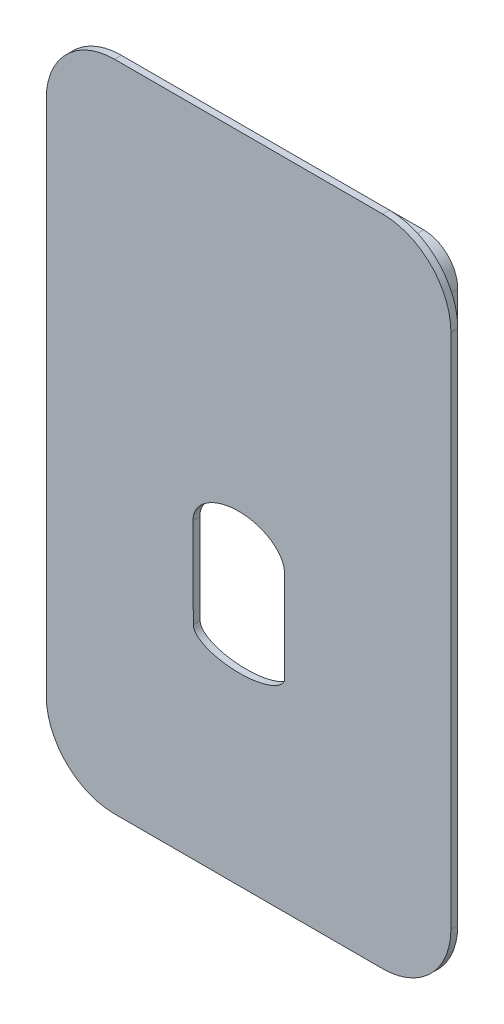
ISO-10303-21;
HEADER;
FILE_DESCRIPTION(('STEP AP214'),'2;1');
FILE_NAME('part.step','',(''),(''),'','','');
FILE_SCHEMA(('AUTOMOTIVE_DESIGN { 1 0 10303 214 1 1 1 1 }'));
ENDSEC;
DATA;
#1=APPLICATION_CONTEXT('core data for automotive mechanical design processes');
#2=APPLICATION_PROTOCOL_DEFINITION('international standard','automotive_design',2000,#1);
#3=PRODUCT_CONTEXT('',#1,'mechanical');
#4=PRODUCT('Part','Part','',(#3));
#5=PRODUCT_RELATED_PRODUCT_CATEGORY('part','',(#4));
#6=PRODUCT_DEFINITION_FORMATION('','',#4);
#7=PRODUCT_DEFINITION_CONTEXT('part definition',#1,'design');
#8=PRODUCT_DEFINITION('design','',#6,#7);
#9=PRODUCT_DEFINITION_SHAPE('','',#8);
#10=(LENGTH_UNIT() NAMED_UNIT(*) SI_UNIT(.MILLI.,.METRE.));
#11=(NAMED_UNIT(*) PLANE_ANGLE_UNIT() SI_UNIT($,.RADIAN.));
#12=(NAMED_UNIT(*) SI_UNIT($,.STERADIAN.) SOLID_ANGLE_UNIT());
#13=UNCERTAINTY_MEASURE_WITH_UNIT(LENGTH_MEASURE(1.E-05),#10,'distance_accuracy_value','');
#14=(GEOMETRIC_REPRESENTATION_CONTEXT(3) GLOBAL_UNCERTAINTY_ASSIGNED_CONTEXT((#13)) GLOBAL_UNIT_ASSIGNED_CONTEXT((#10,
#11,#12)) REPRESENTATION_CONTEXT('',''));
#15=CARTESIAN_POINT('',(0.,0.,0.));
#16=DIRECTION('',(0.,0.,1.));
#17=DIRECTION('',(1.,0.,0.));
#18=AXIS2_PLACEMENT_3D('',#15,#16,#17);
#19=CARTESIAN_POINT('',(-48.5561500397628,95.1688054108552,2.));
#20=DIRECTION('',(0.,1.,0.));
#21=DIRECTION('',(0.,0.,1.));
#22=AXIS2_PLACEMENT_3D('',#19,#20,#21);
#23=PLANE('',#22);
#24=DIRECTION('',(1.,0.,0.));
#25=VECTOR('',#24,1.);
#26=CARTESIAN_POINT('',(-48.5561500397628,95.1688054108552,0.));
#27=LINE('',#26,#25);
#28=CARTESIAN_POINT('',(-48.5561500397628,95.1688054108552,0.));
#29=VERTEX_POINT('',#28);
#30=CARTESIAN_POINT('',(29.9608617764506,95.1688054108552,0.));
#31=VERTEX_POINT('',#30);
#32=EDGE_CURVE('E358',#29,#31,#27,.T.);
#33=ORIENTED_EDGE('',*,*,#32,.F.);
#34=DIRECTION('',(0.,0.,-1.));
#35=VECTOR('',#34,1.);
#36=CARTESIAN_POINT('',(-48.5561500397628,95.1688054108552,2.));
#37=LINE('',#36,#35);
#38=CARTESIAN_POINT('',(-48.5561500397628,95.1688054108552,2.));
#39=VERTEX_POINT('',#38);
#40=EDGE_CURVE('E360',#39,#29,#37,.T.);
#41=ORIENTED_EDGE('',*,*,#40,.F.);
#42=DIRECTION('',(1.,0.,0.));
#43=VECTOR('',#42,1.);
#44=CARTESIAN_POINT('',(-48.5561500397628,95.1688054108552,2.));
#45=LINE('',#44,#43);
#46=CARTESIAN_POINT('',(29.9608617764506,95.1688054108552,2.));
#47=VERTEX_POINT('',#46);
#48=EDGE_CURVE('E392',#39,#47,#45,.T.);
#49=ORIENTED_EDGE('',*,*,#48,.T.);
#50=DIRECTION('',(0.,0.,-1.));
#51=VECTOR('',#50,1.);
#52=CARTESIAN_POINT('',(29.9608617764506,95.1688054108552,2.));
#53=LINE('',#52,#51);
#54=EDGE_CURVE('E362',#47,#31,#53,.T.);
#55=ORIENTED_EDGE('',*,*,#54,.T.);
#56=EDGE_LOOP('',(#33,#41,#49,#55));
#57=FACE_BOUND('',#56,.T.);
#58=ADVANCED_FACE('F37',(#57),#23,.T.);
#59=CARTESIAN_POINT('',(-48.5561500397628,75.1688054108552,2.));
#60=DIRECTION('',(0.,0.,-1.));
#61=DIRECTION('',(-1.,0.,0.));
#62=AXIS2_PLACEMENT_3D('',#59,#60,#61);
#63=CYLINDRICAL_SURFACE('',#62,20.);
#64=CARTESIAN_POINT('',(-48.5561500397628,75.1688054108552,0.));
#65=DIRECTION('',(0.,0.,1.));
#66=DIRECTION('',(1.,0.,0.));
#67=AXIS2_PLACEMENT_3D('',#64,#65,#66);
#68=CIRCLE('',#67,20.);
#69=CARTESIAN_POINT('',(-68.5561500397628,75.1688054011767,0.));
#70=VERTEX_POINT('',#69);
#71=EDGE_CURVE('E390',#29,#70,#68,.T.);
#72=ORIENTED_EDGE('',*,*,#71,.T.);
#73=DIRECTION('',(0.,0.,-1.));
#74=VECTOR('',#73,1.);
#75=CARTESIAN_POINT('',(-68.5561500397628,75.1688054011767,2.));
#76=LINE('',#75,#74);
#77=CARTESIAN_POINT('',(-68.5561500397628,75.1688054011767,2.));
#78=VERTEX_POINT('',#77);
#79=EDGE_CURVE('E395',#78,#70,#76,.T.);
#80=ORIENTED_EDGE('',*,*,#79,.F.);
#81=CARTESIAN_POINT('',(-48.5561500397628,75.1688054108552,2.));
#82=DIRECTION('',(0.,0.,1.));
#83=DIRECTION('',(1.,0.,0.));
#84=AXIS2_PLACEMENT_3D('',#81,#82,#83);
#85=CIRCLE('',#84,20.);
#86=EDGE_CURVE('E375',#39,#78,#85,.T.);
#87=ORIENTED_EDGE('',*,*,#86,.F.);
#88=ORIENTED_EDGE('',*,*,#40,.T.);
#89=EDGE_LOOP('',(#72,#80,#87,#88));
#90=FACE_BOUND('',#89,.T.);
#91=ADVANCED_FACE('F323',(#90),#63,.T.);
#92=CARTESIAN_POINT('',(-68.5561500397628,75.1688054011767,2.));
#93=DIRECTION('',(1.,4.83926662379521E-10,0.));
#94=DIRECTION('',(-4.83926662379521E-10,1.,0.));
#95=AXIS2_PLACEMENT_3D('',#92,#93,#94);
#96=PLANE('',#95);
#97=DIRECTION('',(4.8392666237952E-10,-1.,0.));
#98=VECTOR('',#97,1.);
#99=CARTESIAN_POINT('',(-68.5561500397628,75.1688054011767,0.));
#100=LINE('',#99,#98);
#101=CARTESIAN_POINT('',(-68.556149966485,-76.2544957623988,0.));
#102=VERTEX_POINT('',#101);
#103=EDGE_CURVE('E388',#70,#102,#100,.T.);
#104=ORIENTED_EDGE('',*,*,#103,.T.);
#105=DIRECTION('',(0.,0.,-1.));
#106=VECTOR('',#105,1.);
#107=CARTESIAN_POINT('',(-68.556149966485,-76.2544957623988,2.));
#108=LINE('',#107,#106);
#109=CARTESIAN_POINT('',(-68.556149966485,-76.2544957623988,2.));
#110=VERTEX_POINT('',#109);
#111=EDGE_CURVE('E398',#110,#102,#108,.T.);
#112=ORIENTED_EDGE('',*,*,#111,.F.);
#113=DIRECTION('',(4.8392666237952E-10,-1.,0.));
#114=VECTOR('',#113,1.);
#115=CARTESIAN_POINT('',(-68.5561500397628,75.1688054011767,2.));
#116=LINE('',#115,#114);
#117=EDGE_CURVE('E566',#78,#110,#116,.T.);
#118=ORIENTED_EDGE('',*,*,#117,.F.);
#119=ORIENTED_EDGE('',*,*,#79,.T.);
#120=EDGE_LOOP('',(#104,#112,#118,#119));
#121=FACE_BOUND('',#120,.T.);
#122=ADVANCED_FACE('F326',(#121),#96,.F.);
#123=CARTESIAN_POINT('',(-48.556149966485,-76.2544957527203,2.));
#124=DIRECTION('',(0.,0.,-1.));
#125=DIRECTION('',(-1.,0.,0.));
#126=AXIS2_PLACEMENT_3D('',#123,#124,#125);
#127=CYLINDRICAL_SURFACE('',#126,20.);
#128=CARTESIAN_POINT('',(-48.556149966485,-76.2544957527203,0.));
#129=DIRECTION('',(0.,0.,1.));
#130=DIRECTION('',(1.,0.,0.));
#131=AXIS2_PLACEMENT_3D('',#128,#129,#130);
#132=CIRCLE('',#131,20.);
#133=CARTESIAN_POINT('',(-48.556149966485,-96.2544957527203,0.));
#134=VERTEX_POINT('',#133);
#135=EDGE_CURVE('E386',#102,#134,#132,.T.);
#136=ORIENTED_EDGE('',*,*,#135,.T.);
#137=DIRECTION('',(0.,0.,-1.));
#138=VECTOR('',#137,1.);
#139=CARTESIAN_POINT('',(-48.556149966485,-96.2544957527203,2.));
#140=LINE('',#139,#138);
#141=CARTESIAN_POINT('',(-48.556149966485,-96.2544957527203,2.));
#142=VERTEX_POINT('',#141);
#143=EDGE_CURVE('E401',#142,#134,#140,.T.);
#144=ORIENTED_EDGE('',*,*,#143,.F.);
#145=CARTESIAN_POINT('',(-48.556149966485,-76.2544957527203,2.));
#146=DIRECTION('',(0.,0.,1.));
#147=DIRECTION('',(1.,0.,0.));
#148=AXIS2_PLACEMENT_3D('',#145,#146,#147);
#149=CIRCLE('',#148,20.);
#150=EDGE_CURVE('E565',#110,#142,#149,.T.);
#151=ORIENTED_EDGE('',*,*,#150,.F.);
#152=ORIENTED_EDGE('',*,*,#111,.T.);
#153=EDGE_LOOP('',(#136,#144,#151,#152));
#154=FACE_BOUND('',#153,.T.);
#155=ADVANCED_FACE('F330',(#154),#127,.T.);
#156=CARTESIAN_POINT('',(-48.556149966485,-96.2544957527203,2.));
#157=DIRECTION('',(0.,1.,0.));
#158=DIRECTION('',(-1.,0.,0.));
#159=AXIS2_PLACEMENT_3D('',#156,#157,#158);
#160=PLANE('',#159);
#161=DIRECTION('',(1.,0.,0.));
#162=VECTOR('',#161,1.);
#163=CARTESIAN_POINT('',(-48.556149966485,-96.2544957527203,0.));
#164=LINE('',#163,#162);
#165=CARTESIAN_POINT('',(29.9608617764506,-96.2544957527203,0.));
#166=VERTEX_POINT('',#165);
#167=EDGE_CURVE('E383',#134,#166,#164,.T.);
#168=ORIENTED_EDGE('',*,*,#167,.T.);
#169=DIRECTION('',(0.,0.,-1.));
#170=VECTOR('',#169,1.);
#171=CARTESIAN_POINT('',(29.9608617764506,-96.2544957527203,2.));
#172=LINE('',#171,#170);
#173=CARTESIAN_POINT('',(29.9608617764506,-96.2544957527203,2.));
#174=VERTEX_POINT('',#173);
#175=EDGE_CURVE('E404',#174,#166,#172,.T.);
#176=ORIENTED_EDGE('',*,*,#175,.F.);
#177=DIRECTION('',(1.,0.,0.));
#178=VECTOR('',#177,1.);
#179=CARTESIAN_POINT('',(-48.556149966485,-96.2544957527203,2.));
#180=LINE('',#179,#178);
#181=EDGE_CURVE('E563',#142,#174,#180,.T.);
#182=ORIENTED_EDGE('',*,*,#181,.F.);
#183=ORIENTED_EDGE('',*,*,#143,.T.);
#184=EDGE_LOOP('',(#168,#176,#182,#183));
#185=FACE_BOUND('',#184,.T.);
#186=ADVANCED_FACE('F334',(#185),#160,.F.);
#187=CARTESIAN_POINT('',(29.9608617764506,-76.2544957527203,2.));
#188=DIRECTION('',(0.,0.,-1.));
#189=DIRECTION('',(-1.,0.,0.));
#190=AXIS2_PLACEMENT_3D('',#187,#188,#189);
#191=CYLINDRICAL_SURFACE('',#190,20.);
#192=CARTESIAN_POINT('',(29.9608617764506,-76.2544957527203,0.));
#193=DIRECTION('',(0.,0.,-1.));
#194=DIRECTION('',(-1.,0.,0.));
#195=AXIS2_PLACEMENT_3D('',#192,#193,#194);
#196=CIRCLE('',#195,20.);
#197=CARTESIAN_POINT('',(49.9608617764506,-76.2544957527203,0.));
#198=VERTEX_POINT('',#197);
#199=EDGE_CURVE('E380',#198,#166,#196,.T.);
#200=ORIENTED_EDGE('',*,*,#199,.F.);
#201=DIRECTION('',(0.,0.,-1.));
#202=VECTOR('',#201,1.);
#203=CARTESIAN_POINT('',(49.9608617764506,-76.2544957527203,2.));
#204=LINE('',#203,#202);
#205=CARTESIAN_POINT('',(49.9608617764506,-76.2544957527203,2.));
#206=VERTEX_POINT('',#205);
#207=EDGE_CURVE('E406',#206,#198,#204,.T.);
#208=ORIENTED_EDGE('',*,*,#207,.F.);
#209=CARTESIAN_POINT('',(29.9608617764506,-76.2544957527203,2.));
#210=DIRECTION('',(0.,0.,-1.));
#211=DIRECTION('',(-1.,0.,0.));
#212=AXIS2_PLACEMENT_3D('',#209,#210,#211);
#213=CIRCLE('',#212,20.);
#214=EDGE_CURVE('E560',#206,#174,#213,.T.);
#215=ORIENTED_EDGE('',*,*,#214,.T.);
#216=ORIENTED_EDGE('',*,*,#175,.T.);
#217=EDGE_LOOP('',(#200,#208,#215,#216));
#218=FACE_BOUND('',#217,.T.);
#219=ADVANCED_FACE('F338',(#218),#191,.T.);
#220=CARTESIAN_POINT('',(49.9608617764506,75.1688054108552,2.));
#221=DIRECTION('',(1.,0.,0.));
#222=DIRECTION('',(0.,0.,-1.));
#223=AXIS2_PLACEMENT_3D('',#220,#221,#222);
#224=PLANE('',#223);
#225=DIRECTION('',(0.,-1.,0.));
#226=VECTOR('',#225,1.);
#227=CARTESIAN_POINT('',(49.9608617764506,75.1688054108552,0.));
#228=LINE('',#227,#226);
#229=CARTESIAN_POINT('',(49.9608617764506,75.1688054108552,0.));
#230=VERTEX_POINT('',#229);
#231=EDGE_CURVE('E369',#230,#198,#228,.T.);
#232=ORIENTED_EDGE('',*,*,#231,.F.);
#233=DIRECTION('',(0.,0.,-1.));
#234=VECTOR('',#233,1.);
#235=CARTESIAN_POINT('',(49.9608617764506,75.1688054108552,2.));
#236=LINE('',#235,#234);
#237=CARTESIAN_POINT('',(49.9608617764506,75.1688054108552,2.));
#238=VERTEX_POINT('',#237);
#239=EDGE_CURVE('E408',#238,#230,#236,.T.);
#240=ORIENTED_EDGE('',*,*,#239,.F.);
#241=DIRECTION('',(0.,-1.,0.));
#242=VECTOR('',#241,1.);
#243=CARTESIAN_POINT('',(49.9608617764506,75.1688054108552,2.));
#244=LINE('',#243,#242);
#245=EDGE_CURVE('E557',#238,#206,#244,.T.);
#246=ORIENTED_EDGE('',*,*,#245,.T.);
#247=ORIENTED_EDGE('',*,*,#207,.T.);
#248=EDGE_LOOP('',(#232,#240,#246,#247));
#249=FACE_BOUND('',#248,.T.);
#250=ADVANCED_FACE('F342',(#249),#224,.T.);
#251=CARTESIAN_POINT('',(29.9608617764506,75.1688054108552,2.));
#252=DIRECTION('',(0.,0.,-1.));
#253=DIRECTION('',(-1.,0.,0.));
#254=AXIS2_PLACEMENT_3D('',#251,#252,#253);
#255=CYLINDRICAL_SURFACE('',#254,20.);
#256=CARTESIAN_POINT('',(29.9608617764506,75.1688054108552,0.));
#257=DIRECTION('',(0.,0.,-1.));
#258=DIRECTION('',(-1.,0.,0.));
#259=AXIS2_PLACEMENT_3D('',#256,#257,#258);
#260=CIRCLE('',#259,20.);
#261=EDGE_CURVE('E366',#31,#230,#260,.T.);
#262=ORIENTED_EDGE('',*,*,#261,.F.);
#263=ORIENTED_EDGE('',*,*,#54,.F.);
#264=CARTESIAN_POINT('',(29.9608617764506,75.1688054108552,2.));
#265=DIRECTION('',(0.,0.,-1.));
#266=DIRECTION('',(-1.,0.,0.));
#267=AXIS2_PLACEMENT_3D('',#264,#265,#266);
#268=CIRCLE('',#267,20.);
#269=EDGE_CURVE('E554',#47,#238,#268,.T.);
#270=ORIENTED_EDGE('',*,*,#269,.T.);
#271=ORIENTED_EDGE('',*,*,#239,.T.);
#272=EDGE_LOOP('',(#262,#263,#270,#271));
#273=FACE_BOUND('',#272,.T.);
#274=ADVANCED_FACE('F319',(#273),#255,.T.);
#275=CARTESIAN_POINT('',(29.9608617764506,75.1688054108552,2.));
#276=DIRECTION('',(0.,0.,-1.));
#277=DIRECTION('',(-1.,0.,0.));
#278=AXIS2_PLACEMENT_3D('',#275,#276,#277);
#279=PLANE('',#278);
#280=DIRECTION('',(0.000137732706322048,-0.999999990514851,0.));
#281=VECTOR('',#280,1.);
#282=CARTESIAN_POINT('',(1.24931649522002,-10.4165911787865,2.));
#283=LINE('',#282,#281);
#284=CARTESIAN_POINT('',(1.24931649522002,-10.4165911787865,2.));
#285=VERTEX_POINT('',#284);
#286=CARTESIAN_POINT('',(1.25305055777223,-37.5275266748122,2.));
#287=VERTEX_POINT('',#286);
#288=EDGE_CURVE('E228',#285,#287,#283,.T.);
#289=ORIENTED_EDGE('',*,*,#288,.T.);
#290=CARTESIAN_POINT('',(-12.043749741007,-36.7007987978709,2.));
#291=DIRECTION('',(0.,0.,-1.));
#292=DIRECTION('',(1.,0.,0.));
#293=AXIS2_PLACEMENT_3D('',#290,#291,#292);
#294=ELLIPSE('',#293,13.4456532314958,5.57141059650843);
#295=CARTESIAN_POINT('',(-25.4894029725028,-36.7007987978713,2.));
#296=VERTEX_POINT('',#295);
#297=EDGE_CURVE('E223',#287,#296,#294,.T.);
#298=ORIENTED_EDGE('',*,*,#297,.T.);
#299=DIRECTION('',(-0.00404876312589482,0.999991803724986,0.));
#300=VECTOR('',#299,1.);
#301=CARTESIAN_POINT('',(-25.4894029725028,-36.7007987978713,2.));
#302=LINE('',#301,#300);
#303=CARTESIAN_POINT('',(-25.595818918365,-10.4174450083721,2.));
#304=VERTEX_POINT('',#303);
#305=EDGE_CURVE('E231',#296,#304,#302,.T.);
#306=ORIENTED_EDGE('',*,*,#305,.T.);
#307=CARTESIAN_POINT('',(-12.1732511821712,-10.4174450083722,2.));
#308=DIRECTION('',(0.,0.,-1.));
#309=DIRECTION('',(-1.,0.,0.));
#310=AXIS2_PLACEMENT_3D('',#307,#308,#309);
#311=ELLIPSE('',#310,13.4225677361938,9.12169870674967);
#312=EDGE_CURVE('E51',#304,#285,#311,.T.);
#313=ORIENTED_EDGE('',*,*,#312,.T.);
#314=EDGE_LOOP('',(#289,#298,#306,#313));
#315=FACE_BOUND('',#314,.T.);
#316=ORIENTED_EDGE('',*,*,#48,.F.);
#317=ORIENTED_EDGE('',*,*,#86,.T.);
#318=ORIENTED_EDGE('',*,*,#117,.T.);
#319=ORIENTED_EDGE('',*,*,#150,.T.);
#320=ORIENTED_EDGE('',*,*,#181,.T.);
#321=ORIENTED_EDGE('',*,*,#214,.F.);
#322=ORIENTED_EDGE('',*,*,#245,.F.);
#323=ORIENTED_EDGE('',*,*,#269,.F.);
#324=EDGE_LOOP('',(#316,#317,#318,#319,#320,#321,#322,#323));
#325=FACE_BOUND('',#324,.T.);
#326=ADVANCED_FACE('F235',(#315,#325),#279,.F.);
#327=CARTESIAN_POINT('',(29.9608617764506,75.1688054108552,0.));
#328=DIRECTION('',(0.,0.,-1.));
#329=DIRECTION('',(-1.,0.,0.));
#330=AXIS2_PLACEMENT_3D('',#327,#328,#329);
#331=PLANE('',#330);
#332=DIRECTION('',(4.83926683548097E-10,-1.,0.));
#333=VECTOR('',#332,1.);
#334=CARTESIAN_POINT('',(-58.5561500033866,-2.83368834724838E-08,0.));
#335=LINE('',#334,#333);
#336=CARTESIAN_POINT('',(-58.5561500397628,75.1688054108552,0.));
#337=VERTEX_POINT('',#336);
#338=CARTESIAN_POINT('',(-58.5561499816419,-44.9338570059206,0.));
#339=VERTEX_POINT('',#338);
#340=EDGE_CURVE('E489',#337,#339,#335,.T.);
#341=ORIENTED_EDGE('',*,*,#340,.T.);
#342=CARTESIAN_POINT('',(-48.5561499816419,-44.9338570010813,0.));
#343=DIRECTION('',(0.,0.,1.));
#344=DIRECTION('',(1.,0.,0.));
#345=AXIS2_PLACEMENT_3D('',#342,#343,#344);
#346=CIRCLE('',#345,10.);
#347=CARTESIAN_POINT('',(-48.5561499816419,-54.9338570010813,0.));
#348=VERTEX_POINT('',#347);
#349=EDGE_CURVE('E420',#348,#339,#346,.F.);
#350=ORIENTED_EDGE('',*,*,#349,.F.);
#351=DIRECTION('',(1.,0.,0.));
#352=VECTOR('',#351,1.);
#353=CARTESIAN_POINT('',(0.,-54.9338570010813,0.));
#354=LINE('',#353,#352);
#355=CARTESIAN_POINT('',(29.9608617764506,-54.9338570010813,0.));
#356=VERTEX_POINT('',#355);
#357=EDGE_CURVE('E474',#348,#356,#354,.T.);
#358=ORIENTED_EDGE('',*,*,#357,.T.);
#359=CARTESIAN_POINT('',(29.9608617764506,-44.9338570010813,0.));
#360=DIRECTION('',(0.,0.,1.));
#361=DIRECTION('',(1.,0.,0.));
#362=AXIS2_PLACEMENT_3D('',#359,#360,#361);
#363=CIRCLE('',#362,10.);
#364=CARTESIAN_POINT('',(39.9608617764506,-44.9338570010813,0.));
#365=VERTEX_POINT('',#364);
#366=EDGE_CURVE('E476',#356,#365,#363,.T.);
#367=ORIENTED_EDGE('',*,*,#366,.T.);
#368=DIRECTION('',(0.,-1.,0.));
#369=VECTOR('',#368,1.);
#370=CARTESIAN_POINT('',(39.9608617764506,0.,0.));
#371=LINE('',#370,#369);
#372=CARTESIAN_POINT('',(39.9608617764506,75.1688054108552,0.));
#373=VERTEX_POINT('',#372);
#374=EDGE_CURVE('E478',#373,#365,#371,.T.);
#375=ORIENTED_EDGE('',*,*,#374,.F.);
#376=CARTESIAN_POINT('',(29.9608617764506,75.1688054108552,0.));
#377=DIRECTION('',(0.,0.,1.));
#378=DIRECTION('',(1.,0.,0.));
#379=AXIS2_PLACEMENT_3D('',#376,#377,#378);
#380=CIRCLE('',#379,10.);
#381=CARTESIAN_POINT('',(29.9608617764506,85.1688054108552,0.));
#382=VERTEX_POINT('',#381);
#383=EDGE_CURVE('E481',#382,#373,#380,.F.);
#384=ORIENTED_EDGE('',*,*,#383,.F.);
#385=DIRECTION('',(1.,0.,0.));
#386=VECTOR('',#385,1.);
#387=CARTESIAN_POINT('',(0.,85.1688054108552,0.));
#388=LINE('',#387,#386);
#389=CARTESIAN_POINT('',(-48.5561500397628,85.1688054108552,0.));
#390=VERTEX_POINT('',#389);
#391=EDGE_CURVE('E484',#390,#382,#388,.T.);
#392=ORIENTED_EDGE('',*,*,#391,.F.);
#393=CARTESIAN_POINT('',(-48.5561500397628,75.1688054108552,0.));
#394=DIRECTION('',(0.,0.,1.));
#395=DIRECTION('',(1.,0.,0.));
#396=AXIS2_PLACEMENT_3D('',#393,#394,#395);
#397=CIRCLE('',#396,10.);
#398=EDGE_CURVE('E487',#390,#337,#397,.T.);
#399=ORIENTED_EDGE('',*,*,#398,.T.);
#400=EDGE_LOOP('',(#341,#350,#358,#367,#375,#384,#392,#399));
#401=FACE_BOUND('',#400,.T.);
#402=ORIENTED_EDGE('',*,*,#32,.T.);
#403=ORIENTED_EDGE('',*,*,#261,.T.);
#404=ORIENTED_EDGE('',*,*,#231,.T.);
#405=ORIENTED_EDGE('',*,*,#199,.T.);
#406=ORIENTED_EDGE('',*,*,#167,.F.);
#407=ORIENTED_EDGE('',*,*,#135,.F.);
#408=ORIENTED_EDGE('',*,*,#103,.F.);
#409=ORIENTED_EDGE('',*,*,#71,.F.);
#410=EDGE_LOOP('',(#402,#403,#404,#405,#406,#407,#408,#409));
#411=FACE_BOUND('',#410,.T.);
#412=ADVANCED_FACE('F285',(#401,#411),#331,.T.);
#413=CARTESIAN_POINT('',(37.9608617764506,0.,-10.));
#414=DIRECTION('',(-1.,0.,0.));
#415=DIRECTION('',(0.,0.,1.));
#416=AXIS2_PLACEMENT_3D('',#413,#414,#415);
#417=PLANE('',#416);
#418=DIRECTION('',(0.,-1.,0.));
#419=VECTOR('',#418,1.);
#420=CARTESIAN_POINT('',(37.9608617764506,0.,0.));
#421=LINE('',#420,#419);
#422=CARTESIAN_POINT('',(37.9608617764506,75.1688054108552,0.));
#423=VERTEX_POINT('',#422);
#424=CARTESIAN_POINT('',(37.9608617764506,-44.9338569865635,0.));
#425=VERTEX_POINT('',#424);
#426=EDGE_CURVE('E491',#423,#425,#421,.T.);
#427=ORIENTED_EDGE('',*,*,#426,.F.);
#428=DIRECTION('',(0.,0.,1.));
#429=VECTOR('',#428,1.);
#430=CARTESIAN_POINT('',(37.9608617764506,75.1688054108552,-10.));
#431=LINE('',#430,#429);
#432=CARTESIAN_POINT('',(37.9608617764506,75.1688054108552,-10.));
#433=VERTEX_POINT('',#432);
#434=EDGE_CURVE('E367',#433,#423,#431,.T.);
#435=ORIENTED_EDGE('',*,*,#434,.F.);
#436=DIRECTION('',(0.,-1.,0.));
#437=VECTOR('',#436,1.);
#438=CARTESIAN_POINT('',(37.9608617764506,0.,-10.));
#439=LINE('',#438,#437);
#440=CARTESIAN_POINT('',(37.9608617764506,-44.9338569865635,-10.));
#441=VERTEX_POINT('',#440);
#442=EDGE_CURVE('E448',#433,#441,#439,.T.);
#443=ORIENTED_EDGE('',*,*,#442,.T.);
#444=DIRECTION('',(0.,0.,1.));
#445=VECTOR('',#444,1.);
#446=CARTESIAN_POINT('',(37.9608617764506,-44.9338569865635,-10.));
#447=LINE('',#446,#445);
#448=EDGE_CURVE('E527',#441,#425,#447,.T.);
#449=ORIENTED_EDGE('',*,*,#448,.T.);
#450=EDGE_LOOP('',(#427,#435,#443,#449));
#451=FACE_BOUND('',#450,.T.);
#452=ADVANCED_FACE('F257',(#451),#417,.T.);
#453=CARTESIAN_POINT('',(29.9608617764506,75.1688054108552,-10.));
#454=DIRECTION('',(0.,0.,1.));
#455=DIRECTION('',(1.,0.,0.));
#456=AXIS2_PLACEMENT_3D('',#453,#454,#455);
#457=CYLINDRICAL_SURFACE('',#456,8.);
#458=CARTESIAN_POINT('',(29.9608617764506,75.1688054108552,0.));
#459=DIRECTION('',(0.,0.,1.));
#460=DIRECTION('',(1.,0.,0.));
#461=AXIS2_PLACEMENT_3D('',#458,#459,#460);
#462=CIRCLE('',#461,8.);
#463=CARTESIAN_POINT('',(29.9608617764506,83.1688054108552,0.));
#464=VERTEX_POINT('',#463);
#465=EDGE_CURVE('E430',#464,#423,#462,.F.);
#466=ORIENTED_EDGE('',*,*,#465,.F.);
#467=DIRECTION('',(0.,0.,1.));
#468=VECTOR('',#467,1.);
#469=CARTESIAN_POINT('',(29.9608617764506,83.1688054108552,-10.));
#470=LINE('',#469,#468);
#471=CARTESIAN_POINT('',(29.9608617764506,83.1688054108552,-10.));
#472=VERTEX_POINT('',#471);
#473=EDGE_CURVE('E372',#472,#464,#470,.T.);
#474=ORIENTED_EDGE('',*,*,#473,.F.);
#475=CARTESIAN_POINT('',(29.9608617764506,75.1688054108552,-10.));
#476=DIRECTION('',(0.,0.,1.));
#477=DIRECTION('',(1.,0.,0.));
#478=AXIS2_PLACEMENT_3D('',#475,#476,#477);
#479=CIRCLE('',#478,8.);
#480=EDGE_CURVE('E468',#472,#433,#479,.F.);
#481=ORIENTED_EDGE('',*,*,#480,.T.);
#482=ORIENTED_EDGE('',*,*,#434,.T.);
#483=EDGE_LOOP('',(#466,#474,#481,#482));
#484=FACE_BOUND('',#483,.T.);
#485=ADVANCED_FACE('F253',(#484),#457,.F.);
#486=CARTESIAN_POINT('',(0.,83.1688054108552,-10.));
#487=DIRECTION('',(0.,-1.,0.));
#488=DIRECTION('',(1.,0.,0.));
#489=AXIS2_PLACEMENT_3D('',#486,#487,#488);
#490=PLANE('',#489);
#491=DIRECTION('',(1.,0.,0.));
#492=VECTOR('',#491,1.);
#493=CARTESIAN_POINT('',(0.,83.1688054108552,0.));
#494=LINE('',#493,#492);
#495=CARTESIAN_POINT('',(-48.5561500397628,83.1688054108552,0.));
#496=VERTEX_POINT('',#495);
#497=EDGE_CURVE('E507',#496,#464,#494,.T.);
#498=ORIENTED_EDGE('',*,*,#497,.F.);
#499=DIRECTION('',(0.,0.,1.));
#500=VECTOR('',#499,1.);
#501=CARTESIAN_POINT('',(-48.5561500397628,83.1688054108552,-10.));
#502=LINE('',#501,#500);
#503=CARTESIAN_POINT('',(-48.5561500397628,83.1688054108552,-10.));
#504=VERTEX_POINT('',#503);
#505=EDGE_CURVE('E512',#504,#496,#502,.T.);
#506=ORIENTED_EDGE('',*,*,#505,.F.);
#507=DIRECTION('',(1.,0.,0.));
#508=VECTOR('',#507,1.);
#509=CARTESIAN_POINT('',(0.,83.1688054108552,-10.));
#510=LINE('',#509,#508);
#511=EDGE_CURVE('E465',#504,#472,#510,.T.);
#512=ORIENTED_EDGE('',*,*,#511,.T.);
#513=ORIENTED_EDGE('',*,*,#473,.T.);
#514=EDGE_LOOP('',(#498,#506,#512,#513));
#515=FACE_BOUND('',#514,.T.);
#516=ADVANCED_FACE('F256',(#515),#490,.T.);
#517=CARTESIAN_POINT('',(-48.5561500397628,75.1688054108552,-10.));
#518=DIRECTION('',(0.,0.,1.));
#519=DIRECTION('',(1.,0.,0.));
#520=AXIS2_PLACEMENT_3D('',#517,#518,#519);
#521=CYLINDRICAL_SURFACE('',#520,8.00000000000001);
#522=CARTESIAN_POINT('',(-48.5561500397628,75.1688054108552,0.));
#523=DIRECTION('',(0.,0.,1.));
#524=DIRECTION('',(1.,0.,0.));
#525=AXIS2_PLACEMENT_3D('',#522,#523,#524);
#526=CIRCLE('',#525,8.00000000000001);
#527=CARTESIAN_POINT('',(-56.5561500397628,75.1688054069838,0.));
#528=VERTEX_POINT('',#527);
#529=EDGE_CURVE('E504',#496,#528,#526,.T.);
#530=ORIENTED_EDGE('',*,*,#529,.T.);
#531=DIRECTION('',(0.,0.,1.));
#532=VECTOR('',#531,1.);
#533=CARTESIAN_POINT('',(-56.5561500397628,75.1688054069838,-10.));
#534=LINE('',#533,#532);
#535=CARTESIAN_POINT('',(-56.5561500397628,75.1688054069838,-10.));
#536=VERTEX_POINT('',#535);
#537=EDGE_CURVE('E515',#536,#528,#534,.T.);
#538=ORIENTED_EDGE('',*,*,#537,.F.);
#539=CARTESIAN_POINT('',(-48.5561500397628,75.1688054108552,-10.));
#540=DIRECTION('',(0.,0.,1.));
#541=DIRECTION('',(1.,0.,0.));
#542=AXIS2_PLACEMENT_3D('',#539,#540,#541);
#543=CIRCLE('',#542,8.00000000000001);
#544=EDGE_CURVE('E462',#504,#536,#543,.T.);
#545=ORIENTED_EDGE('',*,*,#544,.F.);
#546=ORIENTED_EDGE('',*,*,#505,.T.);
#547=EDGE_LOOP('',(#530,#538,#545,#546));
#548=FACE_BOUND('',#547,.T.);
#549=ADVANCED_FACE('F261',(#548),#521,.F.);
#550=CARTESIAN_POINT('',(-56.5561500033866,-2.73690301086959E-08,-10.));
#551=DIRECTION('',(-1.,-4.83926683606593E-10,0.));
#552=DIRECTION('',(4.83926683606593E-10,-1.,0.));
#553=AXIS2_PLACEMENT_3D('',#550,#551,#552);
#554=PLANE('',#553);
#555=DIRECTION('',(4.83926683606593E-10,-1.,0.));
#556=VECTOR('',#555,1.);
#557=CARTESIAN_POINT('',(-56.5561500033866,-2.73690301086959E-08,0.));
#558=LINE('',#557,#556);
#559=CARTESIAN_POINT('',(-56.5561499816419,-44.9338569865635,0.));
#560=VERTEX_POINT('',#559);
#561=EDGE_CURVE('E501',#528,#560,#558,.T.);
#562=ORIENTED_EDGE('',*,*,#561,.T.);
#563=DIRECTION('',(0.,0.,1.));
#564=VECTOR('',#563,1.);
#565=CARTESIAN_POINT('',(-56.5561499816419,-44.9338569904349,-10.));
#566=LINE('',#565,#564);
#567=CARTESIAN_POINT('',(-56.5561499816419,-44.9338569904349,-10.));
#568=VERTEX_POINT('',#567);
#569=EDGE_CURVE('E518',#568,#560,#566,.T.);
#570=ORIENTED_EDGE('',*,*,#569,.F.);
#571=DIRECTION('',(4.83926683606593E-10,-1.,0.));
#572=VECTOR('',#571,1.);
#573=CARTESIAN_POINT('',(-56.5561500033866,-2.73690301086959E-08,-10.));
#574=LINE('',#573,#572);
#575=EDGE_CURVE('E459',#536,#568,#574,.T.);
#576=ORIENTED_EDGE('',*,*,#575,.F.);
#577=ORIENTED_EDGE('',*,*,#537,.T.);
#578=EDGE_LOOP('',(#562,#570,#576,#577));
#579=FACE_BOUND('',#578,.T.);
#580=ADVANCED_FACE('F265',(#579),#554,.F.);
#581=CARTESIAN_POINT('',(-48.5561499816419,-44.9338569865635,-10.));
#582=DIRECTION('',(0.,0.,1.));
#583=DIRECTION('',(1.,0.,0.));
#584=AXIS2_PLACEMENT_3D('',#581,#582,#583);
#585=CYLINDRICAL_SURFACE('',#584,8.);
#586=CARTESIAN_POINT('',(-48.5561499816419,-44.9338569865635,0.));
#587=DIRECTION('',(0.,0.,1.));
#588=DIRECTION('',(1.,0.,0.));
#589=AXIS2_PLACEMENT_3D('',#586,#587,#588);
#590=CIRCLE('',#589,8.);
#591=CARTESIAN_POINT('',(-48.5561499816419,-52.9338569865635,0.));
#592=VERTEX_POINT('',#591);
#593=EDGE_CURVE('E498',#560,#592,#590,.T.);
#594=ORIENTED_EDGE('',*,*,#593,.T.);
#595=DIRECTION('',(0.,0.,1.));
#596=VECTOR('',#595,1.);
#597=CARTESIAN_POINT('',(-48.5561499816419,-52.9338569865635,-10.));
#598=LINE('',#597,#596);
#599=CARTESIAN_POINT('',(-48.5561499816419,-52.9338569865635,-10.));
#600=VERTEX_POINT('',#599);
#601=EDGE_CURVE('E521',#600,#592,#598,.T.);
#602=ORIENTED_EDGE('',*,*,#601,.F.);
#603=CARTESIAN_POINT('',(-48.5561499816419,-44.9338569865635,-10.));
#604=DIRECTION('',(0.,0.,1.));
#605=DIRECTION('',(1.,0.,0.));
#606=AXIS2_PLACEMENT_3D('',#603,#604,#605);
#607=CIRCLE('',#606,8.);
#608=EDGE_CURVE('E456',#568,#600,#607,.T.);
#609=ORIENTED_EDGE('',*,*,#608,.F.);
#610=ORIENTED_EDGE('',*,*,#569,.T.);
#611=EDGE_LOOP('',(#594,#602,#609,#610));
#612=FACE_BOUND('',#611,.T.);
#613=ADVANCED_FACE('F269',(#612),#585,.F.);
#614=CARTESIAN_POINT('',(0.,-52.9338569865635,-10.));
#615=DIRECTION('',(0.,-1.,0.));
#616=DIRECTION('',(1.,0.,0.));
#617=AXIS2_PLACEMENT_3D('',#614,#615,#616);
#618=PLANE('',#617);
#619=DIRECTION('',(1.,0.,0.));
#620=VECTOR('',#619,1.);
#621=CARTESIAN_POINT('',(0.,-52.9338569865635,0.));
#622=LINE('',#621,#620);
#623=CARTESIAN_POINT('',(29.9608617764506,-52.9338569865635,0.));
#624=VERTEX_POINT('',#623);
#625=EDGE_CURVE('E495',#592,#624,#622,.T.);
#626=ORIENTED_EDGE('',*,*,#625,.T.);
#627=DIRECTION('',(0.,0.,1.));
#628=VECTOR('',#627,1.);
#629=CARTESIAN_POINT('',(29.9608617764506,-52.9338569865635,-10.));
#630=LINE('',#629,#628);
#631=CARTESIAN_POINT('',(29.9608617764506,-52.9338569865635,-10.));
#632=VERTEX_POINT('',#631);
#633=EDGE_CURVE('E524',#632,#624,#630,.T.);
#634=ORIENTED_EDGE('',*,*,#633,.F.);
#635=DIRECTION('',(1.,0.,0.));
#636=VECTOR('',#635,1.);
#637=CARTESIAN_POINT('',(0.,-52.9338569865635,-10.));
#638=LINE('',#637,#636);
#639=EDGE_CURVE('E454',#600,#632,#638,.T.);
#640=ORIENTED_EDGE('',*,*,#639,.F.);
#641=ORIENTED_EDGE('',*,*,#601,.T.);
#642=EDGE_LOOP('',(#626,#634,#640,#641));
#643=FACE_BOUND('',#642,.T.);
#644=ADVANCED_FACE('F273',(#643),#618,.F.);
#645=CARTESIAN_POINT('',(-48.5561499816419,-44.9338570010813,-10.));
#646=DIRECTION('',(0.,0.,1.));
#647=DIRECTION('',(1.,0.,0.));
#648=AXIS2_PLACEMENT_3D('',#645,#646,#647);
#649=CYLINDRICAL_SURFACE('',#648,10.);
#650=ORIENTED_EDGE('',*,*,#349,.T.);
#651=DIRECTION('',(0.,0.,1.));
#652=VECTOR('',#651,1.);
#653=CARTESIAN_POINT('',(-58.5561499816419,-44.9338570059205,-10.));
#654=LINE('',#653,#652);
#655=CARTESIAN_POINT('',(-58.5561499816419,-44.9338570059205,-10.));
#656=VERTEX_POINT('',#655);
#657=EDGE_CURVE('E530',#656,#339,#654,.T.);
#658=ORIENTED_EDGE('',*,*,#657,.F.);
#659=CARTESIAN_POINT('',(-48.5561499816419,-44.9338570010813,-10.));
#660=DIRECTION('',(0.,0.,1.));
#661=DIRECTION('',(1.,0.,0.));
#662=AXIS2_PLACEMENT_3D('',#659,#660,#661);
#663=CIRCLE('',#662,10.);
#664=CARTESIAN_POINT('',(-48.5561499816419,-54.9338570010813,-10.));
#665=VERTEX_POINT('',#664);
#666=EDGE_CURVE('E427',#665,#656,#663,.F.);
#667=ORIENTED_EDGE('',*,*,#666,.F.);
#668=DIRECTION('',(0.,0.,1.));
#669=VECTOR('',#668,1.);
#670=CARTESIAN_POINT('',(-48.5561499816419,-54.9338570010813,-10.));
#671=LINE('',#670,#669);
#672=EDGE_CURVE('E471',#665,#348,#671,.T.);
#673=ORIENTED_EDGE('',*,*,#672,.T.);
#674=EDGE_LOOP('',(#650,#658,#667,#673));
#675=FACE_BOUND('',#674,.T.);
#676=ADVANCED_FACE('F277',(#675),#649,.T.);
#677=CARTESIAN_POINT('',(-58.5561500033866,-2.83368834724838E-08,-10.));
#678=DIRECTION('',(-1.,-4.83926683548097E-10,0.));
#679=DIRECTION('',(4.83926683548097E-10,-1.,0.));
#680=AXIS2_PLACEMENT_3D('',#677,#678,#679);
#681=PLANE('',#680);
#682=ORIENTED_EDGE('',*,*,#340,.F.);
#683=DIRECTION('',(0.,0.,1.));
#684=VECTOR('',#683,1.);
#685=CARTESIAN_POINT('',(-58.5561500397628,75.1688054060159,-10.));
#686=LINE('',#685,#684);
#687=CARTESIAN_POINT('',(-58.5561500397628,75.1688054060159,-10.));
#688=VERTEX_POINT('',#687);
#689=EDGE_CURVE('E533',#688,#337,#686,.T.);
#690=ORIENTED_EDGE('',*,*,#689,.F.);
#691=DIRECTION('',(4.83926683548097E-10,-1.,0.));
#692=VECTOR('',#691,1.);
#693=CARTESIAN_POINT('',(-58.5561500033866,-2.83368834724838E-08,-10.));
#694=LINE('',#693,#692);
#695=EDGE_CURVE('E445',#688,#656,#694,.T.);
#696=ORIENTED_EDGE('',*,*,#695,.T.);
#697=ORIENTED_EDGE('',*,*,#657,.T.);
#698=EDGE_LOOP('',(#682,#690,#696,#697));
#699=FACE_BOUND('',#698,.T.);
#700=ADVANCED_FACE('F287',(#699),#681,.T.);
#701=CARTESIAN_POINT('',(-48.5561500397628,75.1688054108552,-10.));
#702=DIRECTION('',(0.,0.,1.));
#703=DIRECTION('',(1.,0.,0.));
#704=AXIS2_PLACEMENT_3D('',#701,#702,#703);
#705=CYLINDRICAL_SURFACE('',#704,10.);
#706=ORIENTED_EDGE('',*,*,#398,.F.);
#707=DIRECTION('',(0.,0.,1.));
#708=VECTOR('',#707,1.);
#709=CARTESIAN_POINT('',(-48.5561500397628,85.1688054108552,-10.));
#710=LINE('',#709,#708);
#711=CARTESIAN_POINT('',(-48.5561500397628,85.1688054108552,-10.));
#712=VERTEX_POINT('',#711);
#713=EDGE_CURVE('E536',#712,#390,#710,.T.);
#714=ORIENTED_EDGE('',*,*,#713,.F.);
#715=CARTESIAN_POINT('',(-48.5561500397628,75.1688054108552,-10.));
#716=DIRECTION('',(0.,0.,1.));
#717=DIRECTION('',(1.,0.,0.));
#718=AXIS2_PLACEMENT_3D('',#715,#716,#717);
#719=CIRCLE('',#718,10.);
#720=EDGE_CURVE('E442',#712,#688,#719,.T.);
#721=ORIENTED_EDGE('',*,*,#720,.T.);
#722=ORIENTED_EDGE('',*,*,#689,.T.);
#723=EDGE_LOOP('',(#706,#714,#721,#722));
#724=FACE_BOUND('',#723,.T.);
#725=ADVANCED_FACE('F290',(#724),#705,.T.);
#726=CARTESIAN_POINT('',(0.,85.1688054108552,-10.));
#727=DIRECTION('',(0.,-1.,0.));
#728=DIRECTION('',(1.,0.,0.));
#729=AXIS2_PLACEMENT_3D('',#726,#727,#728);
#730=PLANE('',#729);
#731=ORIENTED_EDGE('',*,*,#391,.T.);
#732=DIRECTION('',(0.,0.,1.));
#733=VECTOR('',#732,1.);
#734=CARTESIAN_POINT('',(29.9608617764506,85.1688054108552,-10.));
#735=LINE('',#734,#733);
#736=CARTESIAN_POINT('',(29.9608617764506,85.1688054108552,-10.));
#737=VERTEX_POINT('',#736);
#738=EDGE_CURVE('E539',#737,#382,#735,.T.);
#739=ORIENTED_EDGE('',*,*,#738,.F.);
#740=DIRECTION('',(1.,0.,0.));
#741=VECTOR('',#740,1.);
#742=CARTESIAN_POINT('',(0.,85.1688054108552,-10.));
#743=LINE('',#742,#741);
#744=EDGE_CURVE('E440',#712,#737,#743,.T.);
#745=ORIENTED_EDGE('',*,*,#744,.F.);
#746=ORIENTED_EDGE('',*,*,#713,.T.);
#747=EDGE_LOOP('',(#731,#739,#745,#746));
#748=FACE_BOUND('',#747,.T.);
#749=ADVANCED_FACE('F294',(#748),#730,.F.);
#750=CARTESIAN_POINT('',(29.9608617764506,75.1688054108552,-10.));
#751=DIRECTION('',(0.,0.,1.));
#752=DIRECTION('',(1.,0.,0.));
#753=AXIS2_PLACEMENT_3D('',#750,#751,#752);
#754=CYLINDRICAL_SURFACE('',#753,10.);
#755=ORIENTED_EDGE('',*,*,#383,.T.);
#756=DIRECTION('',(0.,0.,1.));
#757=VECTOR('',#756,1.);
#758=CARTESIAN_POINT('',(39.9608617764506,75.1688054108552,-10.));
#759=LINE('',#758,#757);
#760=CARTESIAN_POINT('',(39.9608617764506,75.1688054108552,-10.));
#761=VERTEX_POINT('',#760);
#762=EDGE_CURVE('E542',#761,#373,#759,.T.);
#763=ORIENTED_EDGE('',*,*,#762,.F.);
#764=CARTESIAN_POINT('',(29.9608617764506,75.1688054108552,-10.));
#765=DIRECTION('',(0.,0.,1.));
#766=DIRECTION('',(1.,0.,0.));
#767=AXIS2_PLACEMENT_3D('',#764,#765,#766);
#768=CIRCLE('',#767,10.);
#769=EDGE_CURVE('E438',#737,#761,#768,.F.);
#770=ORIENTED_EDGE('',*,*,#769,.F.);
#771=ORIENTED_EDGE('',*,*,#738,.T.);
#772=EDGE_LOOP('',(#755,#763,#770,#771));
#773=FACE_BOUND('',#772,.T.);
#774=ADVANCED_FACE('F298',(#773),#754,.T.);
#775=CARTESIAN_POINT('',(39.9608617764506,0.,-10.));
#776=DIRECTION('',(-1.,0.,0.));
#777=DIRECTION('',(0.,-1.,0.));
#778=AXIS2_PLACEMENT_3D('',#775,#776,#777);
#779=PLANE('',#778);
#780=ORIENTED_EDGE('',*,*,#374,.T.);
#781=DIRECTION('',(0.,0.,1.));
#782=VECTOR('',#781,1.);
#783=CARTESIAN_POINT('',(39.9608617764506,-44.9338570010813,-10.));
#784=LINE('',#783,#782);
#785=CARTESIAN_POINT('',(39.9608617764506,-44.9338570010813,-10.));
#786=VERTEX_POINT('',#785);
#787=EDGE_CURVE('E545',#786,#365,#784,.T.);
#788=ORIENTED_EDGE('',*,*,#787,.F.);
#789=DIRECTION('',(0.,-1.,0.));
#790=VECTOR('',#789,1.);
#791=CARTESIAN_POINT('',(39.9608617764506,0.,-10.));
#792=LINE('',#791,#790);
#793=EDGE_CURVE('E436',#761,#786,#792,.T.);
#794=ORIENTED_EDGE('',*,*,#793,.F.);
#795=ORIENTED_EDGE('',*,*,#762,.T.);
#796=EDGE_LOOP('',(#780,#788,#794,#795));
#797=FACE_BOUND('',#796,.T.);
#798=ADVANCED_FACE('F302',(#797),#779,.F.);
#799=CARTESIAN_POINT('',(29.9608617764506,-44.9338570010813,-10.));
#800=DIRECTION('',(0.,0.,1.));
#801=DIRECTION('',(1.,0.,0.));
#802=AXIS2_PLACEMENT_3D('',#799,#800,#801);
#803=CYLINDRICAL_SURFACE('',#802,10.);
#804=ORIENTED_EDGE('',*,*,#366,.F.);
#805=DIRECTION('',(0.,0.,1.));
#806=VECTOR('',#805,1.);
#807=CARTESIAN_POINT('',(29.9608617764506,-54.9338570010813,-10.));
#808=LINE('',#807,#806);
#809=CARTESIAN_POINT('',(29.9608617764506,-54.9338570010813,-10.));
#810=VERTEX_POINT('',#809);
#811=EDGE_CURVE('E548',#810,#356,#808,.T.);
#812=ORIENTED_EDGE('',*,*,#811,.F.);
#813=CARTESIAN_POINT('',(29.9608617764506,-44.9338570010813,-10.));
#814=DIRECTION('',(0.,0.,1.));
#815=DIRECTION('',(1.,0.,0.));
#816=AXIS2_PLACEMENT_3D('',#813,#814,#815);
#817=CIRCLE('',#816,10.);
#818=EDGE_CURVE('E433',#810,#786,#817,.T.);
#819=ORIENTED_EDGE('',*,*,#818,.T.);
#820=ORIENTED_EDGE('',*,*,#787,.T.);
#821=EDGE_LOOP('',(#804,#812,#819,#820));
#822=FACE_BOUND('',#821,.T.);
#823=ADVANCED_FACE('F306',(#822),#803,.T.);
#824=CARTESIAN_POINT('',(0.,-54.9338570010813,-10.));
#825=DIRECTION('',(0.,-1.,0.));
#826=DIRECTION('',(0.,0.,-1.));
#827=AXIS2_PLACEMENT_3D('',#824,#825,#826);
#828=PLANE('',#827);
#829=ORIENTED_EDGE('',*,*,#357,.F.);
#830=ORIENTED_EDGE('',*,*,#672,.F.);
#831=DIRECTION('',(1.,0.,0.));
#832=VECTOR('',#831,1.);
#833=CARTESIAN_POINT('',(0.,-54.9338570010813,-10.));
#834=LINE('',#833,#832);
#835=EDGE_CURVE('E429',#665,#810,#834,.T.);
#836=ORIENTED_EDGE('',*,*,#835,.T.);
#837=ORIENTED_EDGE('',*,*,#811,.T.);
#838=EDGE_LOOP('',(#829,#830,#836,#837));
#839=FACE_BOUND('',#838,.T.);
#840=ADVANCED_FACE('F281',(#839),#828,.T.);
#841=CARTESIAN_POINT('',(29.9608617764506,-44.9338569865635,-10.));
#842=DIRECTION('',(0.,0.,1.));
#843=DIRECTION('',(1.,0.,0.));
#844=AXIS2_PLACEMENT_3D('',#841,#842,#843);
#845=CYLINDRICAL_SURFACE('',#844,8.);
#846=CARTESIAN_POINT('',(29.9608617764506,-44.9338569865635,0.));
#847=DIRECTION('',(0.,0.,1.));
#848=DIRECTION('',(1.,0.,0.));
#849=AXIS2_PLACEMENT_3D('',#846,#847,#848);
#850=CIRCLE('',#849,8.);
#851=EDGE_CURVE('E493',#425,#624,#850,.F.);
#852=ORIENTED_EDGE('',*,*,#851,.F.);
#853=ORIENTED_EDGE('',*,*,#448,.F.);
#854=CARTESIAN_POINT('',(29.9608617764506,-44.9338569865635,-10.));
#855=DIRECTION('',(0.,0.,1.));
#856=DIRECTION('',(1.,0.,0.));
#857=AXIS2_PLACEMENT_3D('',#854,#855,#856);
#858=CIRCLE('',#857,8.);
#859=EDGE_CURVE('E451',#441,#632,#858,.F.);
#860=ORIENTED_EDGE('',*,*,#859,.T.);
#861=ORIENTED_EDGE('',*,*,#633,.T.);
#862=EDGE_LOOP('',(#852,#853,#860,#861));
#863=FACE_BOUND('',#862,.T.);
#864=ADVANCED_FACE('F251',(#863),#845,.F.);
#865=CARTESIAN_POINT('',(0.,0.,-10.));
#866=DIRECTION('',(0.,0.,1.));
#867=DIRECTION('',(1.,0.,0.));
#868=AXIS2_PLACEMENT_3D('',#865,#866,#867);
#869=PLANE('',#868);
#870=ORIENTED_EDGE('',*,*,#666,.T.);
#871=ORIENTED_EDGE('',*,*,#695,.F.);
#872=ORIENTED_EDGE('',*,*,#720,.F.);
#873=ORIENTED_EDGE('',*,*,#744,.T.);
#874=ORIENTED_EDGE('',*,*,#769,.T.);
#875=ORIENTED_EDGE('',*,*,#793,.T.);
#876=ORIENTED_EDGE('',*,*,#818,.F.);
#877=ORIENTED_EDGE('',*,*,#835,.F.);
#878=EDGE_LOOP('',(#870,#871,#872,#873,#874,#875,#876,#877));
#879=FACE_BOUND('',#878,.T.);
#880=ORIENTED_EDGE('',*,*,#442,.F.);
#881=ORIENTED_EDGE('',*,*,#480,.F.);
#882=ORIENTED_EDGE('',*,*,#511,.F.);
#883=ORIENTED_EDGE('',*,*,#544,.T.);
#884=ORIENTED_EDGE('',*,*,#575,.T.);
#885=ORIENTED_EDGE('',*,*,#608,.T.);
#886=ORIENTED_EDGE('',*,*,#639,.T.);
#887=ORIENTED_EDGE('',*,*,#859,.F.);
#888=EDGE_LOOP('',(#880,#881,#882,#883,#884,#885,#886,#887));
#889=FACE_BOUND('',#888,.T.);
#890=ADVANCED_FACE('F248',(#879,#889),#869,.F.);
#891=CARTESIAN_POINT('',(-12.043749741007,-36.7007987978709,0.));
#892=DIRECTION('',(0.,0.,-1.));
#893=DIRECTION('',(1.,0.,0.));
#894=AXIS2_PLACEMENT_3D('',#891,#892,#893);
#895=ELLIPSE('',#894,13.4456532314958,5.57141059650843);
#896=CARTESIAN_POINT('',(1.25305055777223,-37.5275266748122,0.));
#897=VERTEX_POINT('',#896);
#898=CARTESIAN_POINT('',(-25.4894029725028,-36.7007987978713,0.));
#899=VERTEX_POINT('',#898);
#900=EDGE_CURVE('E11',#897,#899,#895,.T.);
#901=ORIENTED_EDGE('',*,*,#900,.F.);
#902=DIRECTION('',(0.000137732706322048,-0.999999990514851,0.));
#903=VECTOR('',#902,1.);
#904=CARTESIAN_POINT('',(1.23752913170447,75.1648492684779,0.));
#905=LINE('',#904,#903);
#906=CARTESIAN_POINT('',(1.24931649522002,-10.4165911787865,0.));
#907=VERTEX_POINT('',#906);
#908=EDGE_CURVE('E44',#907,#897,#905,.T.);
#909=ORIENTED_EDGE('',*,*,#908,.F.);
#910=CARTESIAN_POINT('',(-12.1732511821712,-10.4174450083722,0.));
#911=DIRECTION('',(0.,0.,-1.));
#912=DIRECTION('',(-1.,0.,0.));
#913=AXIS2_PLACEMENT_3D('',#910,#911,#912);
#914=ELLIPSE('',#913,13.4225677361938,9.12169870674967);
#915=CARTESIAN_POINT('',(-25.595818918365,-10.4174450083722,0.));
#916=VERTEX_POINT('',#915);
#917=EDGE_CURVE('E412',#916,#907,#914,.T.);
#918=ORIENTED_EDGE('',*,*,#917,.F.);
#919=DIRECTION('',(-0.00404876312589482,0.999991803724986,0.));
#920=VECTOR('',#919,1.);
#921=CARTESIAN_POINT('',(-25.9414238210499,74.9424684431547,0.));
#922=LINE('',#921,#920);
#923=EDGE_CURVE('E394',#899,#916,#922,.T.);
#924=ORIENTED_EDGE('',*,*,#923,.F.);
#925=EDGE_LOOP('',(#901,#909,#918,#924));
#926=FACE_BOUND('',#925,.T.);
#927=ORIENTED_EDGE('',*,*,#426,.T.);
#928=ORIENTED_EDGE('',*,*,#851,.T.);
#929=ORIENTED_EDGE('',*,*,#625,.F.);
#930=ORIENTED_EDGE('',*,*,#593,.F.);
#931=ORIENTED_EDGE('',*,*,#561,.F.);
#932=ORIENTED_EDGE('',*,*,#529,.F.);
#933=ORIENTED_EDGE('',*,*,#497,.T.);
#934=ORIENTED_EDGE('',*,*,#465,.T.);
#935=EDGE_LOOP('',(#927,#928,#929,#930,#931,#932,#933,#934));
#936=FACE_BOUND('',#935,.T.);
#937=ADVANCED_FACE('F246',(#926,#936),#331,.T.);
#938=DIRECTION('',(0.,0.,-1.));
#939=VECTOR('',#938,1.);
#940=SURFACE_OF_LINEAR_EXTRUSION('',#294,#939);
#941=ORIENTED_EDGE('',*,*,#900,.T.);
#942=DIRECTION('',(0.,0.,-1.));
#943=VECTOR('',#942,1.);
#944=CARTESIAN_POINT('',(-25.4894029725028,-36.7007987978713,2.));
#945=LINE('',#944,#943);
#946=EDGE_CURVE('E59',#296,#899,#945,.T.);
#947=ORIENTED_EDGE('',*,*,#946,.F.);
#948=ORIENTED_EDGE('',*,*,#297,.F.);
#949=DIRECTION('',(0.,0.,-1.));
#950=VECTOR('',#949,1.);
#951=CARTESIAN_POINT('',(1.25305055777223,-37.5275266748122,2.));
#952=LINE('',#951,#950);
#953=EDGE_CURVE('E416',#287,#897,#952,.T.);
#954=ORIENTED_EDGE('',*,*,#953,.T.);
#955=EDGE_LOOP('',(#941,#947,#948,#954));
#956=FACE_BOUND('',#955,.T.);
#957=ADVANCED_FACE('F220',(#956),#940,.F.);
#958=CARTESIAN_POINT('',(1.24931649522002,-10.4165911787865,2.));
#959=DIRECTION('',(0.999999990514851,0.000137732706322048,0.));
#960=DIRECTION('',(-0.000137732706322048,0.999999990514851,0.));
#961=AXIS2_PLACEMENT_3D('',#958,#959,#960);
#962=PLANE('',#961);
#963=ORIENTED_EDGE('',*,*,#908,.T.);
#964=ORIENTED_EDGE('',*,*,#953,.F.);
#965=ORIENTED_EDGE('',*,*,#288,.F.);
#966=DIRECTION('',(0.,0.,-1.));
#967=VECTOR('',#966,1.);
#968=CARTESIAN_POINT('',(1.24931649522002,-10.4165911787865,2.));
#969=LINE('',#968,#967);
#970=EDGE_CURVE('E417',#285,#907,#969,.T.);
#971=ORIENTED_EDGE('',*,*,#970,.T.);
#972=EDGE_LOOP('',(#963,#964,#965,#971));
#973=FACE_BOUND('',#972,.T.);
#974=ADVANCED_FACE('F245',(#973),#962,.F.);
#975=DIRECTION('',(0.,0.,-1.));
#976=VECTOR('',#975,1.);
#977=SURFACE_OF_LINEAR_EXTRUSION('',#311,#976);
#978=ORIENTED_EDGE('',*,*,#917,.T.);
#979=ORIENTED_EDGE('',*,*,#970,.F.);
#980=ORIENTED_EDGE('',*,*,#312,.F.);
#981=DIRECTION('',(0.,0.,-1.));
#982=VECTOR('',#981,1.);
#983=CARTESIAN_POINT('',(-25.595818918365,-10.4174450083722,2.));
#984=LINE('',#983,#982);
#985=EDGE_CURVE('E227',#304,#916,#984,.T.);
#986=ORIENTED_EDGE('',*,*,#985,.T.);
#987=EDGE_LOOP('',(#978,#979,#980,#986));
#988=FACE_BOUND('',#987,.T.);
#989=ADVANCED_FACE('F423',(#988),#977,.F.);
#990=CARTESIAN_POINT('',(-25.4894029725028,-36.7007987978713,2.));
#991=DIRECTION('',(-0.999991803724986,-0.00404876312589482,0.));
#992=DIRECTION('',(0.00404876312589482,-0.999991803724986,0.));
#993=AXIS2_PLACEMENT_3D('',#990,#991,#992);
#994=PLANE('',#993);
#995=ORIENTED_EDGE('',*,*,#923,.T.);
#996=ORIENTED_EDGE('',*,*,#985,.F.);
#997=ORIENTED_EDGE('',*,*,#305,.F.);
#998=ORIENTED_EDGE('',*,*,#946,.T.);
#999=EDGE_LOOP('',(#995,#996,#997,#998));
#1000=FACE_BOUND('',#999,.T.);
#1001=ADVANCED_FACE('F232',(#1000),#994,.F.);
#1002=CLOSED_SHELL('',(#58,#91,#122,#155,#186,#219,#250,#274,#326,#412,#452,#485,#516,#549,#580,
#613,#644,#676,#700,#725,#749,#774,#798,#823,#840,#864,#890,#937,#957,#974,#989,#1001));
#1003=MANIFOLD_SOLID_BREP('B2',#1002);
#1004=ADVANCED_BREP_SHAPE_REPRESENTATION('',(#18,#1003),#14);
#1005=SHAPE_DEFINITION_REPRESENTATION(#9,#1004);
ENDSEC;
END-ISO-10303-21;
